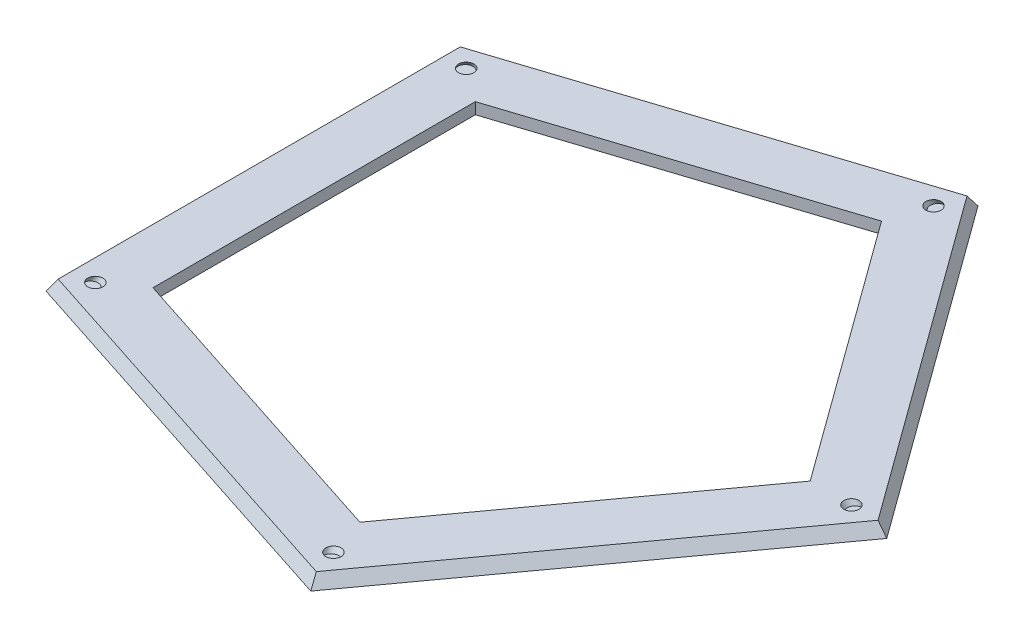
ISO-10303-21;
HEADER;
FILE_DESCRIPTION(('STEP AP214'),'2;1');
FILE_NAME('part.step','',(''),(''),'','','');
FILE_SCHEMA(('AUTOMOTIVE_DESIGN { 1 0 10303 214 1 1 1 1 }'));
ENDSEC;
DATA;
#1=APPLICATION_CONTEXT('core data for automotive mechanical design processes');
#2=APPLICATION_PROTOCOL_DEFINITION('international standard','automotive_design',2000,#1);
#3=PRODUCT_CONTEXT('',#1,'mechanical');
#4=PRODUCT('Part','Part','',(#3));
#5=PRODUCT_RELATED_PRODUCT_CATEGORY('part','',(#4));
#6=PRODUCT_DEFINITION_FORMATION('','',#4);
#7=PRODUCT_DEFINITION_CONTEXT('part definition',#1,'design');
#8=PRODUCT_DEFINITION('design','',#6,#7);
#9=PRODUCT_DEFINITION_SHAPE('','',#8);
#10=(LENGTH_UNIT() NAMED_UNIT(*) SI_UNIT(.MILLI.,.METRE.));
#11=(NAMED_UNIT(*) PLANE_ANGLE_UNIT() SI_UNIT($,.RADIAN.));
#12=(NAMED_UNIT(*) SI_UNIT($,.STERADIAN.) SOLID_ANGLE_UNIT());
#13=UNCERTAINTY_MEASURE_WITH_UNIT(LENGTH_MEASURE(1.E-05),#10,'distance_accuracy_value','');
#14=(GEOMETRIC_REPRESENTATION_CONTEXT(3) GLOBAL_UNCERTAINTY_ASSIGNED_CONTEXT((#13)) GLOBAL_UNIT_ASSIGNED_CONTEXT((#10,
#11,#12)) REPRESENTATION_CONTEXT('',''));
#15=CARTESIAN_POINT('',(0.,0.,0.));
#16=DIRECTION('',(0.,0.,1.));
#17=DIRECTION('',(1.,0.,0.));
#18=AXIS2_PLACEMENT_3D('',#15,#16,#17);
#19=CARTESIAN_POINT('',(0.,3.,0.));
#20=DIRECTION('',(0.,1.,0.));
#21=DIRECTION('',(0.,0.,1.));
#22=AXIS2_PLACEMENT_3D('',#19,#20,#21);
#23=PLANE('',#22);
#24=CARTESIAN_POINT('',(-67.1329581156992,3.,48.7749491018581));
#25=DIRECTION('',(0.,1.,0.));
#26=DIRECTION('',(0.,0.,1.));
#27=AXIS2_PLACEMENT_3D('',#24,#25,#26);
#28=CIRCLE('',#27,2.);
#29=CARTESIAN_POINT('',(-67.1329581156992,3.,50.7749491018581));
#30=VERTEX_POINT('',#29);
#31=EDGE_CURVE('E408',#30,#30,#28,.T.);
#32=ORIENTED_EDGE('',*,*,#31,.F.);
#33=EDGE_LOOP('',(#32));
#34=FACE_BOUND('',#33,.T.);
#35=CARTESIAN_POINT('',(25.642508234874,3.,78.9195254463525));
#36=DIRECTION('',(0.,1.,0.));
#37=DIRECTION('',(0.,0.,1.));
#38=AXIS2_PLACEMENT_3D('',#35,#36,#37);
#39=CIRCLE('',#38,2.);
#40=CARTESIAN_POINT('',(25.642508234874,3.,80.9195254463525));
#41=VERTEX_POINT('',#40);
#42=EDGE_CURVE('E407',#41,#41,#39,.T.);
#43=ORIENTED_EDGE('',*,*,#42,.F.);
#44=EDGE_LOOP('',(#43));
#45=FACE_BOUND('',#44,.T.);
#46=CARTESIAN_POINT('',(82.9808997616503,3.,0.));
#47=DIRECTION('',(0.,1.,0.));
#48=DIRECTION('',(0.,0.,1.));
#49=AXIS2_PLACEMENT_3D('',#46,#47,#48);
#50=CIRCLE('',#49,2.);
#51=CARTESIAN_POINT('',(82.9808997616503,3.,2.));
#52=VERTEX_POINT('',#51);
#53=EDGE_CURVE('E415',#52,#52,#50,.T.);
#54=ORIENTED_EDGE('',*,*,#53,.F.);
#55=EDGE_LOOP('',(#54));
#56=FACE_BOUND('',#55,.T.);
#57=CARTESIAN_POINT('',(25.642508234874,3.,-78.9195254463525));
#58=DIRECTION('',(0.,1.,0.));
#59=DIRECTION('',(0.,0.,1.));
#60=AXIS2_PLACEMENT_3D('',#57,#58,#59);
#61=CIRCLE('',#60,2.);
#62=CARTESIAN_POINT('',(25.642508234874,3.,-76.9195254463525));
#63=VERTEX_POINT('',#62);
#64=EDGE_CURVE('E280',#63,#63,#61,.T.);
#65=ORIENTED_EDGE('',*,*,#64,.F.);
#66=EDGE_LOOP('',(#65));
#67=FACE_BOUND('',#66,.T.);
#68=CARTESIAN_POINT('',(-67.1329581156992,3.,-48.7749491018581));
#69=DIRECTION('',(0.,1.,0.));
#70=DIRECTION('',(0.,0.,1.));
#71=AXIS2_PLACEMENT_3D('',#68,#69,#70);
#72=CIRCLE('',#71,2.);
#73=CARTESIAN_POINT('',(-67.1329581156992,3.,-46.7749491018581));
#74=VERTEX_POINT('',#73);
#75=EDGE_CURVE('E273',#74,#74,#72,.T.);
#76=ORIENTED_EDGE('',*,*,#75,.F.);
#77=EDGE_LOOP('',(#76));
#78=FACE_BOUND('',#77,.T.);
#79=DIRECTION('',(-0.587785252292473,0.,-0.809016994374948));
#80=VECTOR('',#79,1.);
#81=CARTESIAN_POINT('',(47.2061416217782,3.,-34.2972694712658));
#82=LINE('',#81,#80);
#83=CARTESIAN_POINT('',(72.1245664871127,3.,0.));
#84=VERTEX_POINT('',#83);
#85=CARTESIAN_POINT('',(22.2877167564436,3.,-68.5945389425316));
#86=VERTEX_POINT('',#85);
#87=EDGE_CURVE('E167',#84,#86,#82,.T.);
#88=ORIENTED_EDGE('',*,*,#87,.F.);
#89=DIRECTION('',(0.587785252292473,0.,-0.809016994374948));
#90=VECTOR('',#89,1.);
#91=CARTESIAN_POINT('',(47.2061416217782,3.,34.2972694712658));
#92=LINE('',#91,#90);
#93=CARTESIAN_POINT('',(22.2877167564436,3.,68.5945389425316));
#94=VERTEX_POINT('',#93);
#95=EDGE_CURVE('E165',#94,#84,#92,.T.);
#96=ORIENTED_EDGE('',*,*,#95,.F.);
#97=DIRECTION('',(0.951056516295154,0.,0.309016994374947));
#98=VECTOR('',#97,1.);
#99=CARTESIAN_POINT('',(-18.0311416217782,3.,55.4941477258222));
#100=LINE('',#99,#98);
#101=CARTESIAN_POINT('',(-58.35,3.,42.3937565091128));
#102=VERTEX_POINT('',#101);
#103=EDGE_CURVE('E163',#102,#94,#100,.T.);
#104=ORIENTED_EDGE('',*,*,#103,.F.);
#105=DIRECTION('',(0.,0.,1.));
#106=VECTOR('',#105,1.);
#107=CARTESIAN_POINT('',(-58.35,3.,0.));
#108=LINE('',#107,#106);
#109=CARTESIAN_POINT('',(-58.35,3.,-42.3937565091128));
#110=VERTEX_POINT('',#109);
#111=EDGE_CURVE('E128',#110,#102,#108,.T.);
#112=ORIENTED_EDGE('',*,*,#111,.F.);
#113=DIRECTION('',(-0.951056516295154,0.,0.309016994374948));
#114=VECTOR('',#113,1.);
#115=CARTESIAN_POINT('',(-18.0311416217782,3.,-55.4941477258222));
#116=LINE('',#115,#114);
#117=EDGE_CURVE('E136',#86,#110,#116,.T.);
#118=ORIENTED_EDGE('',*,*,#117,.F.);
#119=EDGE_LOOP('',(#88,#96,#104,#112,#118));
#120=FACE_BOUND('',#119,.T.);
#121=DIRECTION('',(-0.951056516295154,0.,0.309016994374948));
#122=VECTOR('',#121,1.);
#123=CARTESIAN_POINT('',(-74.0771063103228,3.,-52.473214238329));
#124=LINE('',#123,#122);
#125=CARTESIAN_POINT('',(27.8056271954986,3.,-85.5769210604186));
#126=VERTEX_POINT('',#125);
#127=CARTESIAN_POINT('',(-72.7960770763238,3.,-52.8894458679054));
#128=VERTEX_POINT('',#127);
#129=EDGE_CURVE('E42',#126,#128,#124,.T.);
#130=ORIENTED_EDGE('',*,*,#129,.T.);
#131=DIRECTION('',(0.,0.,1.));
#132=VECTOR('',#131,1.);
#133=CARTESIAN_POINT('',(-72.7960770763238,3.,54.2363997156002));
#134=LINE('',#133,#132);
#135=CARTESIAN_POINT('',(-72.7960770763238,3.,52.8894458679054));
#136=VERTEX_POINT('',#135);
#137=EDGE_CURVE('E12',#128,#136,#134,.T.);
#138=ORIENTED_EDGE('',*,*,#137,.T.);
#139=DIRECTION('',(0.951056516295154,0.,0.309016994374947));
#140=VECTOR('',#139,1.);
#141=CARTESIAN_POINT('',(29.0866564294976,3.,85.993152689995));
#142=LINE('',#141,#140);
#143=CARTESIAN_POINT('',(27.8056271954986,3.,85.5769210604186));
#144=VERTEX_POINT('',#143);
#145=EDGE_CURVE('E185',#136,#144,#142,.T.);
#146=ORIENTED_EDGE('',*,*,#145,.T.);
#147=DIRECTION('',(0.587785252292473,0.,-0.809016994374947));
#148=VECTOR('',#147,1.);
#149=CARTESIAN_POINT('',(90.772619368844,3.,-1.08970855342381));
#150=LINE('',#149,#148);
#151=CARTESIAN_POINT('',(89.9808997616504,3.,0.));
#152=VERTEX_POINT('',#151);
#153=EDGE_CURVE('E187',#144,#152,#150,.T.);
#154=ORIENTED_EDGE('',*,*,#153,.T.);
#155=DIRECTION('',(-0.587785252292473,0.,-0.809016994374948));
#156=VECTOR('',#155,1.);
#157=CARTESIAN_POINT('',(27.013907588305,3.,-86.6666296138425));
#158=LINE('',#157,#156);
#159=EDGE_CURVE('E189',#152,#126,#158,.T.);
#160=ORIENTED_EDGE('',*,*,#159,.T.);
#161=EDGE_LOOP('',(#130,#138,#146,#154,#160));
#162=FACE_BOUND('',#161,.T.);
#163=ADVANCED_FACE('F33',(#34,#45,#56,#67,#78,#120,#162),#23,.T.);
#164=CARTESIAN_POINT('',(0.,0.,0.));
#165=DIRECTION('',(0.,1.,0.));
#166=DIRECTION('',(0.,0.,1.));
#167=AXIS2_PLACEMENT_3D('',#164,#165,#166);
#168=PLANE('',#167);
#169=DIRECTION('',(0.587785252292473,0.,-0.809016994374947));
#170=VECTOR('',#169,1.);
#171=CARTESIAN_POINT('',(22.2877167564436,0.,68.5945389425316));
#172=LINE('',#171,#170);
#173=CARTESIAN_POINT('',(22.2877167564436,0.,68.5945389425316));
#174=VERTEX_POINT('',#173);
#175=CARTESIAN_POINT('',(72.1245664871127,0.,0.));
#176=VERTEX_POINT('',#175);
#177=EDGE_CURVE('E129',#174,#176,#172,.T.);
#178=ORIENTED_EDGE('',*,*,#177,.T.);
#179=DIRECTION('',(-0.587785252292473,0.,-0.809016994374947));
#180=VECTOR('',#179,1.);
#181=CARTESIAN_POINT('',(72.1245664871127,0.,0.));
#182=LINE('',#181,#180);
#183=CARTESIAN_POINT('',(22.2877167564436,0.,-68.5945389425316));
#184=VERTEX_POINT('',#183);
#185=EDGE_CURVE('E157',#176,#184,#182,.T.);
#186=ORIENTED_EDGE('',*,*,#185,.T.);
#187=DIRECTION('',(-0.951056516295154,0.,0.309016994374948));
#188=VECTOR('',#187,1.);
#189=CARTESIAN_POINT('',(22.2877167564436,0.,-68.5945389425316));
#190=LINE('',#189,#188);
#191=CARTESIAN_POINT('',(-58.35,0.,-42.3937565091128));
#192=VERTEX_POINT('',#191);
#193=EDGE_CURVE('E134',#184,#192,#190,.T.);
#194=ORIENTED_EDGE('',*,*,#193,.T.);
#195=DIRECTION('',(0.,0.,1.));
#196=VECTOR('',#195,1.);
#197=CARTESIAN_POINT('',(-58.35,0.,-42.3937565091128));
#198=LINE('',#197,#196);
#199=CARTESIAN_POINT('',(-58.35,0.,42.3937565091128));
#200=VERTEX_POINT('',#199);
#201=EDGE_CURVE('E125',#192,#200,#198,.T.);
#202=ORIENTED_EDGE('',*,*,#201,.T.);
#203=DIRECTION('',(0.951056516295154,0.,0.309016994374947));
#204=VECTOR('',#203,1.);
#205=CARTESIAN_POINT('',(-58.35,0.,42.3937565091128));
#206=LINE('',#205,#204);
#207=EDGE_CURVE('E112',#200,#174,#206,.T.);
#208=ORIENTED_EDGE('',*,*,#207,.T.);
#209=EDGE_LOOP('',(#178,#186,#194,#202,#208));
#210=FACE_BOUND('',#209,.T.);
#211=DIRECTION('',(0.951056516295154,0.,0.309016994374947));
#212=VECTOR('',#211,1.);
#213=CARTESIAN_POINT('',(-74.65,0.,54.2363997156002));
#214=LINE('',#213,#212);
#215=CARTESIAN_POINT('',(-74.65,0.,54.2363997156002));
#216=VERTEX_POINT('',#215);
#217=CARTESIAN_POINT('',(28.5137627398203,0.,87.7563381672663));
#218=VERTEX_POINT('',#217);
#219=EDGE_CURVE('E170',#216,#218,#214,.T.);
#220=ORIENTED_EDGE('',*,*,#219,.F.);
#221=DIRECTION('',(0.,0.,1.));
#222=VECTOR('',#221,1.);
#223=CARTESIAN_POINT('',(-74.65,0.,-54.2363997156002));
#224=LINE('',#223,#222);
#225=CARTESIAN_POINT('',(-74.65,0.,-54.2363997156002));
#226=VERTEX_POINT('',#225);
#227=EDGE_CURVE('E182',#226,#216,#224,.T.);
#228=ORIENTED_EDGE('',*,*,#227,.F.);
#229=DIRECTION('',(-0.951056516295154,0.,0.309016994374948));
#230=VECTOR('',#229,1.);
#231=CARTESIAN_POINT('',(28.5137627398203,0.,-87.7563381672663));
#232=LINE('',#231,#230);
#233=CARTESIAN_POINT('',(28.5137627398203,0.,-87.7563381672663));
#234=VERTEX_POINT('',#233);
#235=EDGE_CURVE('E179',#234,#226,#232,.T.);
#236=ORIENTED_EDGE('',*,*,#235,.F.);
#237=DIRECTION('',(-0.587785252292473,0.,-0.809016994374947));
#238=VECTOR('',#237,1.);
#239=CARTESIAN_POINT('',(92.2724745203593,0.,0.));
#240=LINE('',#239,#238);
#241=CARTESIAN_POINT('',(92.2724745203593,0.,0.));
#242=VERTEX_POINT('',#241);
#243=EDGE_CURVE('E176',#242,#234,#240,.T.);
#244=ORIENTED_EDGE('',*,*,#243,.F.);
#245=DIRECTION('',(0.587785252292473,0.,-0.809016994374947));
#246=VECTOR('',#245,1.);
#247=CARTESIAN_POINT('',(28.5137627398203,0.,87.7563381672663));
#248=LINE('',#247,#246);
#249=EDGE_CURVE('E173',#218,#242,#248,.T.);
#250=ORIENTED_EDGE('',*,*,#249,.F.);
#251=EDGE_LOOP('',(#220,#228,#236,#244,#250));
#252=FACE_BOUND('',#251,.T.);
#253=ADVANCED_FACE('F131',(#210,#252),#168,.F.);
#254=CARTESIAN_POINT('',(58.8932634785745,3.,-42.7884605302093));
#255=DIRECTION('',(0.688209327963417,0.525694374889672,-0.500013344935411));
#256=DIRECTION('',(0.587785252292473,0.,0.809016994374948));
#257=AXIS2_PLACEMENT_3D('',#254,#255,#256);
#258=PLANE('',#257);
#259=DIRECTION('',(-0.187581034297645,0.794682751636109,0.577315061144162));
#260=VECTOR('',#259,1.);
#261=CARTESIAN_POINT('',(24.2657907984177,17.9964357479248,-74.6824248568291));
#262=LINE('',#261,#260);
#263=EDGE_CURVE('E197',#126,#234,#262,.F.);
#264=ORIENTED_EDGE('',*,*,#263,.F.);
#265=ORIENTED_EDGE('',*,*,#159,.F.);
#266=DIRECTION('',(-0.607024978276892,0.79468275163611,0.));
#267=VECTOR('',#266,1.);
#268=CARTESIAN_POINT('',(78.5257485514686,17.9964357479249,0.));
#269=LINE('',#268,#267);
#270=EDGE_CURVE('E37',#242,#152,#269,.T.);
#271=ORIENTED_EDGE('',*,*,#270,.F.);
#272=ORIENTED_EDGE('',*,*,#243,.T.);
#273=EDGE_LOOP('',(#264,#265,#271,#272));
#274=FACE_BOUND('',#273,.T.);
#275=ADVANCED_FACE('F35',(#274),#258,.T.);
#276=CARTESIAN_POINT('',(58.8932634785745,3.,42.7884605302093));
#277=DIRECTION('',(0.688209327963419,0.525694374889669,0.500013344935413));
#278=DIRECTION('',(-0.587785252292473,0.,0.809016994374947));
#279=AXIS2_PLACEMENT_3D('',#276,#277,#278);
#280=PLANE('',#279);
#281=ORIENTED_EDGE('',*,*,#270,.T.);
#282=ORIENTED_EDGE('',*,*,#153,.F.);
#283=DIRECTION('',(-0.187581034297641,0.794682751636111,-0.577315061144162));
#284=VECTOR('',#283,1.);
#285=CARTESIAN_POINT('',(24.2657907984178,17.9964357479247,74.6824248568291));
#286=LINE('',#285,#284);
#287=EDGE_CURVE('E195',#218,#144,#286,.T.);
#288=ORIENTED_EDGE('',*,*,#287,.F.);
#289=ORIENTED_EDGE('',*,*,#249,.T.);
#290=EDGE_LOOP('',(#281,#282,#288,#289));
#291=FACE_BOUND('',#290,.T.);
#292=ADVANCED_FACE('F206',(#291),#280,.T.);
#293=CARTESIAN_POINT('',(-22.4952249404126,3.,-69.233183464162));
#294=DIRECTION('',(-0.262872571907302,0.52569437488967,-0.809038586934022));
#295=DIRECTION('',(0.951056516295154,0.,-0.309016994374948));
#296=AXIS2_PLACEMENT_3D('',#293,#294,#295);
#297=PLANE('',#296);
#298=ORIENTED_EDGE('',*,*,#263,.T.);
#299=ORIENTED_EDGE('',*,*,#235,.T.);
#300=DIRECTION('',(0.49109352343609,0.79468275163611,0.356800330004315));
#301=VECTOR('',#300,1.);
#302=CARTESIAN_POINT('',(-63.528665074152,17.9964357479249,-46.1562769237803));
#303=LINE('',#302,#301);
#304=EDGE_CURVE('E193',#128,#226,#303,.F.);
#305=ORIENTED_EDGE('',*,*,#304,.F.);
#306=ORIENTED_EDGE('',*,*,#129,.F.);
#307=EDGE_LOOP('',(#298,#299,#305,#306));
#308=FACE_BOUND('',#307,.T.);
#309=ADVANCED_FACE('F220',(#308),#297,.T.);
#310=CARTESIAN_POINT('',(-22.4952249404126,3.,69.233183464162));
#311=DIRECTION('',(-0.262872571907302,0.52569437488967,0.809038586934022));
#312=DIRECTION('',(-0.951056516295154,0.,-0.309016994374947));
#313=AXIS2_PLACEMENT_3D('',#310,#311,#312);
#314=PLANE('',#313);
#315=ORIENTED_EDGE('',*,*,#287,.T.);
#316=ORIENTED_EDGE('',*,*,#145,.F.);
#317=DIRECTION('',(-0.49109352343609,-0.794682751636109,0.356800330004315));
#318=VECTOR('',#317,1.);
#319=CARTESIAN_POINT('',(-63.528665074152,17.9964357479249,46.1562769237803));
#320=LINE('',#319,#318);
#321=EDGE_CURVE('E169',#216,#136,#320,.F.);
#322=ORIENTED_EDGE('',*,*,#321,.F.);
#323=ORIENTED_EDGE('',*,*,#219,.T.);
#324=EDGE_LOOP('',(#315,#316,#322,#323));
#325=FACE_BOUND('',#324,.T.);
#326=ADVANCED_FACE('F216',(#325),#314,.T.);
#327=CARTESIAN_POINT('',(-72.7960770763238,3.,0.));
#328=DIRECTION('',(-0.850673512112231,0.525694374889672,0.));
#329=DIRECTION('',(0.,0.,-1.));
#330=AXIS2_PLACEMENT_3D('',#327,#328,#329);
#331=PLANE('',#330);
#332=ORIENTED_EDGE('',*,*,#304,.T.);
#333=ORIENTED_EDGE('',*,*,#227,.T.);
#334=ORIENTED_EDGE('',*,*,#321,.T.);
#335=ORIENTED_EDGE('',*,*,#137,.F.);
#336=EDGE_LOOP('',(#332,#333,#334,#335));
#337=FACE_BOUND('',#336,.T.);
#338=ADVANCED_FACE('F219',(#337),#331,.T.);
#339=CARTESIAN_POINT('',(72.1245664871127,0.,0.));
#340=DIRECTION('',(0.809016994374947,0.,-0.587785252292473));
#341=DIRECTION('',(-0.587785252292473,0.,-0.809016994374948));
#342=AXIS2_PLACEMENT_3D('',#339,#340,#341);
#343=PLANE('',#342);
#344=ORIENTED_EDGE('',*,*,#87,.T.);
#345=DIRECTION('',(0.,1.,0.));
#346=VECTOR('',#345,1.);
#347=CARTESIAN_POINT('',(22.2877167564436,0.,-68.5945389425316));
#348=LINE('',#347,#346);
#349=EDGE_CURVE('E50',#184,#86,#348,.T.);
#350=ORIENTED_EDGE('',*,*,#349,.F.);
#351=ORIENTED_EDGE('',*,*,#185,.F.);
#352=DIRECTION('',(0.,1.,0.));
#353=VECTOR('',#352,1.);
#354=CARTESIAN_POINT('',(72.1245664871127,0.,0.));
#355=LINE('',#354,#353);
#356=EDGE_CURVE('E154',#176,#84,#355,.T.);
#357=ORIENTED_EDGE('',*,*,#356,.T.);
#358=EDGE_LOOP('',(#344,#350,#351,#357));
#359=FACE_BOUND('',#358,.T.);
#360=ADVANCED_FACE('F242',(#359),#343,.F.);
#361=CARTESIAN_POINT('',(22.2877167564436,0.,68.5945389425316));
#362=DIRECTION('',(0.809016994374947,0.,0.587785252292473));
#363=DIRECTION('',(0.587785252292473,0.,-0.809016994374948));
#364=AXIS2_PLACEMENT_3D('',#361,#362,#363);
#365=PLANE('',#364);
#366=ORIENTED_EDGE('',*,*,#95,.T.);
#367=ORIENTED_EDGE('',*,*,#356,.F.);
#368=ORIENTED_EDGE('',*,*,#177,.F.);
#369=DIRECTION('',(0.,1.,0.));
#370=VECTOR('',#369,1.);
#371=CARTESIAN_POINT('',(22.2877167564436,0.,68.5945389425316));
#372=LINE('',#371,#370);
#373=EDGE_CURVE('E118',#174,#94,#372,.T.);
#374=ORIENTED_EDGE('',*,*,#373,.T.);
#375=EDGE_LOOP('',(#366,#367,#368,#374));
#376=FACE_BOUND('',#375,.T.);
#377=ADVANCED_FACE('F246',(#376),#365,.F.);
#378=CARTESIAN_POINT('',(-58.35,0.,42.3937565091128));
#379=DIRECTION('',(-0.309016994374947,0.,0.951056516295154));
#380=DIRECTION('',(0.951056516295154,0.,0.309016994374947));
#381=AXIS2_PLACEMENT_3D('',#378,#379,#380);
#382=PLANE('',#381);
#383=ORIENTED_EDGE('',*,*,#103,.T.);
#384=ORIENTED_EDGE('',*,*,#373,.F.);
#385=ORIENTED_EDGE('',*,*,#207,.F.);
#386=DIRECTION('',(0.,1.,0.));
#387=VECTOR('',#386,1.);
#388=CARTESIAN_POINT('',(-58.35,0.,42.3937565091128));
#389=LINE('',#388,#387);
#390=EDGE_CURVE('E115',#200,#102,#389,.T.);
#391=ORIENTED_EDGE('',*,*,#390,.T.);
#392=EDGE_LOOP('',(#383,#384,#385,#391));
#393=FACE_BOUND('',#392,.T.);
#394=ADVANCED_FACE('F114',(#393),#382,.F.);
#395=CARTESIAN_POINT('',(-58.35,0.,-42.3937565091128));
#396=DIRECTION('',(-1.,0.,0.));
#397=DIRECTION('',(0.,0.,1.));
#398=AXIS2_PLACEMENT_3D('',#395,#396,#397);
#399=PLANE('',#398);
#400=ORIENTED_EDGE('',*,*,#111,.T.);
#401=ORIENTED_EDGE('',*,*,#390,.F.);
#402=ORIENTED_EDGE('',*,*,#201,.F.);
#403=DIRECTION('',(0.,1.,0.));
#404=VECTOR('',#403,1.);
#405=CARTESIAN_POINT('',(-58.35,0.,-42.3937565091128));
#406=LINE('',#405,#404);
#407=EDGE_CURVE('E55',#192,#110,#406,.T.);
#408=ORIENTED_EDGE('',*,*,#407,.T.);
#409=EDGE_LOOP('',(#400,#401,#402,#408));
#410=FACE_BOUND('',#409,.T.);
#411=ADVANCED_FACE('F124',(#410),#399,.F.);
#412=CARTESIAN_POINT('',(22.2877167564436,0.,-68.5945389425316));
#413=DIRECTION('',(-0.309016994374948,0.,-0.951056516295154));
#414=DIRECTION('',(-0.951056516295154,0.,0.309016994374948));
#415=AXIS2_PLACEMENT_3D('',#412,#413,#414);
#416=PLANE('',#415);
#417=ORIENTED_EDGE('',*,*,#117,.T.);
#418=ORIENTED_EDGE('',*,*,#407,.F.);
#419=ORIENTED_EDGE('',*,*,#193,.F.);
#420=ORIENTED_EDGE('',*,*,#349,.T.);
#421=EDGE_LOOP('',(#417,#418,#419,#420));
#422=FACE_BOUND('',#421,.T.);
#423=ADVANCED_FACE('F238',(#422),#416,.F.);
#424=CARTESIAN_POINT('',(-67.8695984008533,1.80797587254584,-49.3101495968646));
#425=DIRECTION('',(0.,1.,0.));
#426=DIRECTION('',(0.,0.,1.));
#427=AXIS2_PLACEMENT_3D('',#424,#425,#426);
#428=CIRCLE('',#427,2.);
#429=DIRECTION('',(0.491093523436093,0.794682751636106,0.35680033000432));
#430=VECTOR('',#429,1.);
#431=SURFACE_OF_LINEAR_EXTRUSION('',#428,#430);
#432=CARTESIAN_POINT('',(-67.8695984008533,1.80797587254584,-47.3101495968646));
#433=VERTEX_POINT('',#432);
#434=EDGE_CURVE('E158',#433,#433,#428,.T.);
#435=ORIENTED_EDGE('',*,*,#434,.F.);
#436=EDGE_LOOP('',(#435));
#437=FACE_BOUND('',#436,.T.);
#438=ORIENTED_EDGE('',*,*,#75,.T.);
#439=EDGE_LOOP('',(#438));
#440=FACE_BOUND('',#439,.T.);
#441=ADVANCED_FACE('F249',(#437,#440),#431,.F.);
#442=CARTESIAN_POINT('',(-67.8695984008533,1.80797587254584,-49.3101495968646));
#443=DIRECTION('',(0.,1.,0.));
#444=DIRECTION('',(0.,0.,1.));
#445=AXIS2_PLACEMENT_3D('',#442,#443,#444);
#446=PLANE('',#445);
#447=ORIENTED_EDGE('',*,*,#434,.T.);
#448=EDGE_LOOP('',(#447));
#449=FACE_BOUND('',#448,.T.);
#450=ADVANCED_FACE('F255',(#449),#446,.T.);
#451=CARTESIAN_POINT('',(25.9238797863204,1.80797587254584,-79.7854980380688));
#452=DIRECTION('',(0.,1.,0.));
#453=DIRECTION('',(0.,0.,1.));
#454=AXIS2_PLACEMENT_3D('',#451,#452,#453);
#455=CIRCLE('',#454,2.);
#456=DIRECTION('',(-0.187581034297642,0.794682751636107,0.577315061144167));
#457=VECTOR('',#456,1.);
#458=SURFACE_OF_LINEAR_EXTRUSION('',#455,#457);
#459=CARTESIAN_POINT('',(25.9238797863204,1.80797587254584,-77.7854980380688));
#460=VERTEX_POINT('',#459);
#461=EDGE_CURVE('E276',#460,#460,#455,.T.);
#462=ORIENTED_EDGE('',*,*,#461,.F.);
#463=EDGE_LOOP('',(#462));
#464=FACE_BOUND('',#463,.T.);
#465=ORIENTED_EDGE('',*,*,#64,.T.);
#466=EDGE_LOOP('',(#465));
#467=FACE_BOUND('',#466,.T.);
#468=ADVANCED_FACE('F315',(#464,#467),#458,.F.);
#469=CARTESIAN_POINT('',(25.9238797863204,1.80797587254584,-79.7854980380688));
#470=DIRECTION('',(0.,1.,0.));
#471=DIRECTION('',(0.,0.,1.));
#472=AXIS2_PLACEMENT_3D('',#469,#470,#471);
#473=PLANE('',#472);
#474=ORIENTED_EDGE('',*,*,#461,.T.);
#475=EDGE_LOOP('',(#474));
#476=FACE_BOUND('',#475,.T.);
#477=ADVANCED_FACE('F324',(#476),#473,.T.);
#478=CARTESIAN_POINT('',(83.8914372290657,1.80797587254584,0.));
#479=DIRECTION('',(0.,1.,0.));
#480=DIRECTION('',(0.,0.,1.));
#481=AXIS2_PLACEMENT_3D('',#478,#479,#480);
#482=CIRCLE('',#481,2.);
#483=DIRECTION('',(-0.607024978276893,0.794682751636109,0.));
#484=VECTOR('',#483,1.);
#485=SURFACE_OF_LINEAR_EXTRUSION('',#482,#484);
#486=CARTESIAN_POINT('',(83.8914372290657,1.80797587254584,1.99999999999999));
#487=VERTEX_POINT('',#486);
#488=EDGE_CURVE('E417',#487,#487,#482,.T.);
#489=ORIENTED_EDGE('',*,*,#488,.F.);
#490=EDGE_LOOP('',(#489));
#491=FACE_BOUND('',#490,.T.);
#492=ORIENTED_EDGE('',*,*,#53,.T.);
#493=EDGE_LOOP('',(#492));
#494=FACE_BOUND('',#493,.T.);
#495=ADVANCED_FACE('F333',(#491,#494),#485,.F.);
#496=CARTESIAN_POINT('',(83.8914372290657,1.80797587254584,0.));
#497=DIRECTION('',(0.,1.,0.));
#498=DIRECTION('',(0.,0.,1.));
#499=AXIS2_PLACEMENT_3D('',#496,#497,#498);
#500=PLANE('',#499);
#501=ORIENTED_EDGE('',*,*,#488,.T.);
#502=EDGE_LOOP('',(#501));
#503=FACE_BOUND('',#502,.T.);
#504=ADVANCED_FACE('F343',(#503),#500,.T.);
#505=CARTESIAN_POINT('',(25.9238797863204,1.80797587254584,79.7854980380688));
#506=DIRECTION('',(0.,1.,0.));
#507=DIRECTION('',(0.,0.,1.));
#508=AXIS2_PLACEMENT_3D('',#505,#506,#507);
#509=CIRCLE('',#508,2.);
#510=DIRECTION('',(-0.187581034297645,0.794682751636106,-0.577315061144166));
#511=VECTOR('',#510,1.);
#512=SURFACE_OF_LINEAR_EXTRUSION('',#509,#511);
#513=CARTESIAN_POINT('',(25.9238797863204,1.80797587254584,81.7854980380688));
#514=VERTEX_POINT('',#513);
#515=EDGE_CURVE('E411',#514,#514,#509,.T.);
#516=ORIENTED_EDGE('',*,*,#515,.F.);
#517=EDGE_LOOP('',(#516));
#518=FACE_BOUND('',#517,.T.);
#519=ORIENTED_EDGE('',*,*,#42,.T.);
#520=EDGE_LOOP('',(#519));
#521=FACE_BOUND('',#520,.T.);
#522=ADVANCED_FACE('F353',(#518,#521),#512,.F.);
#523=CARTESIAN_POINT('',(25.9238797863204,1.80797587254584,79.7854980380688));
#524=DIRECTION('',(0.,1.,0.));
#525=DIRECTION('',(0.,0.,1.));
#526=AXIS2_PLACEMENT_3D('',#523,#524,#525);
#527=PLANE('',#526);
#528=ORIENTED_EDGE('',*,*,#515,.T.);
#529=EDGE_LOOP('',(#528));
#530=FACE_BOUND('',#529,.T.);
#531=ADVANCED_FACE('F363',(#530),#527,.T.);
#532=CARTESIAN_POINT('',(-67.8695984008533,1.80797587254584,49.3101495968645));
#533=DIRECTION('',(0.,1.,0.));
#534=DIRECTION('',(0.,0.,1.));
#535=AXIS2_PLACEMENT_3D('',#532,#533,#534);
#536=CIRCLE('',#535,2.);
#537=DIRECTION('',(0.491093523436093,0.794682751636106,-0.356800330004319));
#538=VECTOR('',#537,1.);
#539=SURFACE_OF_LINEAR_EXTRUSION('',#536,#538);
#540=CARTESIAN_POINT('',(-67.8695984008533,1.80797587254584,51.3101495968645));
#541=VERTEX_POINT('',#540);
#542=EDGE_CURVE('E404',#541,#541,#536,.T.);
#543=ORIENTED_EDGE('',*,*,#542,.F.);
#544=EDGE_LOOP('',(#543));
#545=FACE_BOUND('',#544,.T.);
#546=ORIENTED_EDGE('',*,*,#31,.T.);
#547=EDGE_LOOP('',(#546));
#548=FACE_BOUND('',#547,.T.);
#549=ADVANCED_FACE('F372',(#545,#548),#539,.F.);
#550=CARTESIAN_POINT('',(-67.8695984008533,1.80797587254584,49.3101495968645));
#551=DIRECTION('',(0.,1.,0.));
#552=DIRECTION('',(0.,0.,1.));
#553=AXIS2_PLACEMENT_3D('',#550,#551,#552);
#554=PLANE('',#553);
#555=ORIENTED_EDGE('',*,*,#542,.T.);
#556=EDGE_LOOP('',(#555));
#557=FACE_BOUND('',#556,.T.);
#558=ADVANCED_FACE('F388',(#557),#554,.T.);
#559=CLOSED_SHELL('',(#163,#253,#275,#292,#309,#326,#338,#360,#377,#394,#411,#423,#441,#450,
#468,#477,#495,#504,#522,#531,#549,#558));
#560=MANIFOLD_SOLID_BREP('B2',#559);
#561=ADVANCED_BREP_SHAPE_REPRESENTATION('',(#18,#560),#14);
#562=SHAPE_DEFINITION_REPRESENTATION(#9,#561);
ENDSEC;
END-ISO-10303-21;
